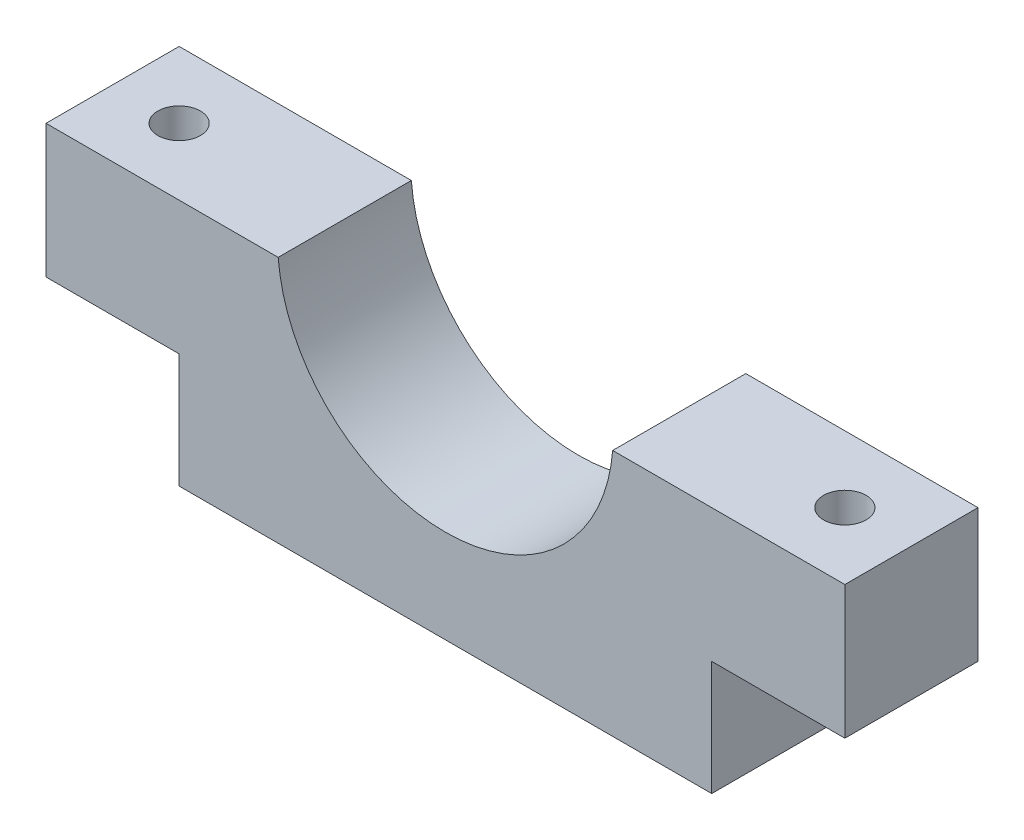
ISO-10303-21;
HEADER;
FILE_DESCRIPTION(('STEP AP214'),'2;1');
FILE_NAME('part.step','',(''),(''),'','','');
FILE_SCHEMA(('AUTOMOTIVE_DESIGN { 1 0 10303 214 1 1 1 1 }'));
ENDSEC;
DATA;
#1=APPLICATION_CONTEXT('core data for automotive mechanical design processes');
#2=APPLICATION_PROTOCOL_DEFINITION('international standard','automotive_design',2000,#1);
#3=PRODUCT_CONTEXT('',#1,'mechanical');
#4=PRODUCT('Part','Part','',(#3));
#5=PRODUCT_RELATED_PRODUCT_CATEGORY('part','',(#4));
#6=PRODUCT_DEFINITION_FORMATION('','',#4);
#7=PRODUCT_DEFINITION_CONTEXT('part definition',#1,'design');
#8=PRODUCT_DEFINITION('design','',#6,#7);
#9=PRODUCT_DEFINITION_SHAPE('','',#8);
#10=(LENGTH_UNIT() NAMED_UNIT(*) SI_UNIT(.MILLI.,.METRE.));
#11=(NAMED_UNIT(*) PLANE_ANGLE_UNIT() SI_UNIT($,.RADIAN.));
#12=(NAMED_UNIT(*) SI_UNIT($,.STERADIAN.) SOLID_ANGLE_UNIT());
#13=UNCERTAINTY_MEASURE_WITH_UNIT(LENGTH_MEASURE(1.E-05),#10,'distance_accuracy_value','');
#14=(GEOMETRIC_REPRESENTATION_CONTEXT(3) GLOBAL_UNCERTAINTY_ASSIGNED_CONTEXT((#13)) GLOBAL_UNIT_ASSIGNED_CONTEXT((#10,
#11,#12)) REPRESENTATION_CONTEXT('',''));
#15=CARTESIAN_POINT('',(0.,0.,0.));
#16=DIRECTION('',(0.,0.,1.));
#17=DIRECTION('',(1.,0.,0.));
#18=AXIS2_PLACEMENT_3D('',#15,#16,#17);
#19=CARTESIAN_POINT('',(0.,9.3,10.));
#20=DIRECTION('',(0.,-1.,0.));
#21=DIRECTION('',(0.,0.,-1.));
#22=AXIS2_PLACEMENT_3D('',#19,#20,#21);
#23=PLANE('',#22);
#24=CARTESIAN_POINT('',(-25.,9.3,5.));
#25=DIRECTION('',(0.,1.,0.));
#26=DIRECTION('',(0.,0.,-1.));
#27=AXIS2_PLACEMENT_3D('',#24,#25,#26);
#28=CIRCLE('',#27,1.6);
#29=CARTESIAN_POINT('',(-25.,9.3,3.4));
#30=VERTEX_POINT('',#29);
#31=EDGE_CURVE('E269',#30,#30,#28,.T.);
#32=ORIENTED_EDGE('',*,*,#31,.F.);
#33=EDGE_LOOP('',(#32));
#34=FACE_BOUND('',#33,.T.);
#35=DIRECTION('',(-1.,0.,0.));
#36=VECTOR('',#35,1.);
#37=CARTESIAN_POINT('',(0.,9.3,0.));
#38=LINE('',#37,#36);
#39=CARTESIAN_POINT('',(-12.5602547744861,9.3,0.));
#40=VERTEX_POINT('',#39);
#41=CARTESIAN_POINT('',(-30.,9.3,0.));
#42=VERTEX_POINT('',#41);
#43=EDGE_CURVE('E154',#40,#42,#38,.T.);
#44=ORIENTED_EDGE('',*,*,#43,.T.);
#45=DIRECTION('',(0.,0.,-1.));
#46=VECTOR('',#45,1.);
#47=CARTESIAN_POINT('',(-30.,9.3,10.));
#48=LINE('',#47,#46);
#49=CARTESIAN_POINT('',(-30.,9.3,10.));
#50=VERTEX_POINT('',#49);
#51=EDGE_CURVE('E11',#50,#42,#48,.T.);
#52=ORIENTED_EDGE('',*,*,#51,.F.);
#53=DIRECTION('',(-1.,0.,0.));
#54=VECTOR('',#53,1.);
#55=CARTESIAN_POINT('',(0.,9.3,10.));
#56=LINE('',#55,#54);
#57=CARTESIAN_POINT('',(-12.5602547744861,9.3,10.));
#58=VERTEX_POINT('',#57);
#59=EDGE_CURVE('E189',#58,#50,#56,.T.);
#60=ORIENTED_EDGE('',*,*,#59,.F.);
#61=DIRECTION('',(0.,0.,-1.));
#62=VECTOR('',#61,1.);
#63=CARTESIAN_POINT('',(-12.5602547744861,9.3,10.));
#64=LINE('',#63,#62);
#65=EDGE_CURVE('E58',#58,#40,#64,.T.);
#66=ORIENTED_EDGE('',*,*,#65,.T.);
#67=EDGE_LOOP('',(#44,#52,#60,#66));
#68=FACE_BOUND('',#67,.T.);
#69=ADVANCED_FACE('F41',(#34,#68),#23,.F.);
#70=CARTESIAN_POINT('',(-30.,0.,10.));
#71=DIRECTION('',(1.,0.,0.));
#72=DIRECTION('',(0.,0.,-1.));
#73=AXIS2_PLACEMENT_3D('',#70,#71,#72);
#74=PLANE('',#73);
#75=DIRECTION('',(0.,-1.,0.));
#76=VECTOR('',#75,1.);
#77=CARTESIAN_POINT('',(-30.,0.,0.));
#78=LINE('',#77,#76);
#79=CARTESIAN_POINT('',(-30.,-0.699999999999999,0.));
#80=VERTEX_POINT('',#79);
#81=EDGE_CURVE('E157',#42,#80,#78,.T.);
#82=ORIENTED_EDGE('',*,*,#81,.T.);
#83=DIRECTION('',(0.,0.,-1.));
#84=VECTOR('',#83,1.);
#85=CARTESIAN_POINT('',(-30.,-0.699999999999999,10.));
#86=LINE('',#85,#84);
#87=CARTESIAN_POINT('',(-30.,-0.699999999999999,10.));
#88=VERTEX_POINT('',#87);
#89=EDGE_CURVE('E50',#88,#80,#86,.T.);
#90=ORIENTED_EDGE('',*,*,#89,.F.);
#91=DIRECTION('',(0.,-1.,0.));
#92=VECTOR('',#91,1.);
#93=CARTESIAN_POINT('',(-30.,0.,10.));
#94=LINE('',#93,#92);
#95=EDGE_CURVE('E102',#50,#88,#94,.T.);
#96=ORIENTED_EDGE('',*,*,#95,.F.);
#97=ORIENTED_EDGE('',*,*,#51,.T.);
#98=EDGE_LOOP('',(#82,#90,#96,#97));
#99=FACE_BOUND('',#98,.T.);
#100=ADVANCED_FACE('F216',(#99),#74,.F.);
#101=CARTESIAN_POINT('',(0.,-0.700000000000002,10.));
#102=DIRECTION('',(0.,-1.,0.));
#103=DIRECTION('',(1.,0.,0.));
#104=AXIS2_PLACEMENT_3D('',#101,#102,#103);
#105=PLANE('',#104);
#106=CARTESIAN_POINT('',(-25.,-0.699999999999999,5.));
#107=DIRECTION('',(0.,1.,0.));
#108=DIRECTION('',(0.,0.,-1.));
#109=AXIS2_PLACEMENT_3D('',#106,#107,#108);
#110=CIRCLE('',#109,1.6);
#111=CARTESIAN_POINT('',(-25.,-0.699999999999999,3.4));
#112=VERTEX_POINT('',#111);
#113=EDGE_CURVE('E274',#112,#112,#110,.T.);
#114=ORIENTED_EDGE('',*,*,#113,.T.);
#115=EDGE_LOOP('',(#114));
#116=FACE_BOUND('',#115,.T.);
#117=DIRECTION('',(-1.,0.,0.));
#118=VECTOR('',#117,1.);
#119=CARTESIAN_POINT('',(0.,-0.700000000000002,0.));
#120=LINE('',#119,#118);
#121=CARTESIAN_POINT('',(-20.,-0.7,0.));
#122=VERTEX_POINT('',#121);
#123=EDGE_CURVE('E162',#122,#80,#120,.T.);
#124=ORIENTED_EDGE('',*,*,#123,.F.);
#125=DIRECTION('',(0.,0.,-1.));
#126=VECTOR('',#125,1.);
#127=CARTESIAN_POINT('',(-20.,-0.7,10.));
#128=LINE('',#127,#126);
#129=CARTESIAN_POINT('',(-20.,-0.7,10.));
#130=VERTEX_POINT('',#129);
#131=EDGE_CURVE('E207',#130,#122,#128,.T.);
#132=ORIENTED_EDGE('',*,*,#131,.F.);
#133=DIRECTION('',(-1.,0.,0.));
#134=VECTOR('',#133,1.);
#135=CARTESIAN_POINT('',(0.,-0.700000000000002,10.));
#136=LINE('',#135,#134);
#137=EDGE_CURVE('E215',#130,#88,#136,.T.);
#138=ORIENTED_EDGE('',*,*,#137,.T.);
#139=ORIENTED_EDGE('',*,*,#89,.T.);
#140=EDGE_LOOP('',(#124,#132,#138,#139));
#141=FACE_BOUND('',#140,.T.);
#142=ADVANCED_FACE('F213',(#116,#141),#105,.T.);
#143=CARTESIAN_POINT('',(-20.,0.,10.));
#144=DIRECTION('',(-1.,0.,0.));
#145=DIRECTION('',(0.,0.,1.));
#146=AXIS2_PLACEMENT_3D('',#143,#144,#145);
#147=PLANE('',#146);
#148=DIRECTION('',(0.,1.,0.));
#149=VECTOR('',#148,1.);
#150=CARTESIAN_POINT('',(-20.,0.,0.));
#151=LINE('',#150,#149);
#152=CARTESIAN_POINT('',(-20.,-9.3,0.));
#153=VERTEX_POINT('',#152);
#154=EDGE_CURVE('E166',#153,#122,#151,.T.);
#155=ORIENTED_EDGE('',*,*,#154,.F.);
#156=DIRECTION('',(0.,0.,-1.));
#157=VECTOR('',#156,1.);
#158=CARTESIAN_POINT('',(-20.,-9.3,10.));
#159=LINE('',#158,#157);
#160=CARTESIAN_POINT('',(-20.,-9.3,10.));
#161=VERTEX_POINT('',#160);
#162=EDGE_CURVE('E204',#161,#153,#159,.T.);
#163=ORIENTED_EDGE('',*,*,#162,.F.);
#164=DIRECTION('',(0.,1.,0.));
#165=VECTOR('',#164,1.);
#166=CARTESIAN_POINT('',(-20.,0.,10.));
#167=LINE('',#166,#165);
#168=EDGE_CURVE('E228',#161,#130,#167,.T.);
#169=ORIENTED_EDGE('',*,*,#168,.T.);
#170=ORIENTED_EDGE('',*,*,#131,.T.);
#171=EDGE_LOOP('',(#155,#163,#169,#170));
#172=FACE_BOUND('',#171,.T.);
#173=ADVANCED_FACE('F224',(#172),#147,.T.);
#174=CARTESIAN_POINT('',(0.,-9.3,10.));
#175=DIRECTION('',(0.,1.,0.));
#176=DIRECTION('',(0.,0.,1.));
#177=AXIS2_PLACEMENT_3D('',#174,#175,#176);
#178=PLANE('',#177);
#179=DIRECTION('',(1.,0.,0.));
#180=VECTOR('',#179,1.);
#181=CARTESIAN_POINT('',(0.,-9.3,0.));
#182=LINE('',#181,#180);
#183=CARTESIAN_POINT('',(20.,-9.3,0.));
#184=VERTEX_POINT('',#183);
#185=EDGE_CURVE('E170',#153,#184,#182,.T.);
#186=ORIENTED_EDGE('',*,*,#185,.T.);
#187=DIRECTION('',(0.,0.,-1.));
#188=VECTOR('',#187,1.);
#189=CARTESIAN_POINT('',(20.,-9.3,10.));
#190=LINE('',#189,#188);
#191=CARTESIAN_POINT('',(20.,-9.3,10.));
#192=VERTEX_POINT('',#191);
#193=EDGE_CURVE('E200',#192,#184,#190,.T.);
#194=ORIENTED_EDGE('',*,*,#193,.F.);
#195=DIRECTION('',(1.,0.,0.));
#196=VECTOR('',#195,1.);
#197=CARTESIAN_POINT('',(0.,-9.3,10.));
#198=LINE('',#197,#196);
#199=EDGE_CURVE('E233',#161,#192,#198,.T.);
#200=ORIENTED_EDGE('',*,*,#199,.F.);
#201=ORIENTED_EDGE('',*,*,#162,.T.);
#202=EDGE_LOOP('',(#186,#194,#200,#201));
#203=FACE_BOUND('',#202,.T.);
#204=ADVANCED_FACE('F333',(#203),#178,.F.);
#205=CARTESIAN_POINT('',(20.,0.,10.));
#206=DIRECTION('',(-1.,0.,0.));
#207=DIRECTION('',(0.,0.,1.));
#208=AXIS2_PLACEMENT_3D('',#205,#206,#207);
#209=PLANE('',#208);
#210=DIRECTION('',(0.,1.,0.));
#211=VECTOR('',#210,1.);
#212=CARTESIAN_POINT('',(20.,0.,0.));
#213=LINE('',#212,#211);
#214=CARTESIAN_POINT('',(20.,-0.699999999999994,0.));
#215=VERTEX_POINT('',#214);
#216=EDGE_CURVE('E173',#184,#215,#213,.T.);
#217=ORIENTED_EDGE('',*,*,#216,.T.);
#218=DIRECTION('',(0.,0.,-1.));
#219=VECTOR('',#218,1.);
#220=CARTESIAN_POINT('',(20.,-0.699999999999994,10.));
#221=LINE('',#220,#219);
#222=CARTESIAN_POINT('',(20.,-0.699999999999994,10.));
#223=VERTEX_POINT('',#222);
#224=EDGE_CURVE('E196',#223,#215,#221,.T.);
#225=ORIENTED_EDGE('',*,*,#224,.F.);
#226=DIRECTION('',(0.,1.,0.));
#227=VECTOR('',#226,1.);
#228=CARTESIAN_POINT('',(20.,0.,10.));
#229=LINE('',#228,#227);
#230=EDGE_CURVE('E240',#192,#223,#229,.T.);
#231=ORIENTED_EDGE('',*,*,#230,.F.);
#232=ORIENTED_EDGE('',*,*,#193,.T.);
#233=EDGE_LOOP('',(#217,#225,#231,#232));
#234=FACE_BOUND('',#233,.T.);
#235=ADVANCED_FACE('F247',(#234),#209,.F.);
#236=CARTESIAN_POINT('',(0.,-0.699999999999992,10.));
#237=DIRECTION('',(0.,1.,0.));
#238=DIRECTION('',(-1.,0.,0.));
#239=AXIS2_PLACEMENT_3D('',#236,#237,#238);
#240=PLANE('',#239);
#241=CARTESIAN_POINT('',(25.,-0.699999999999999,5.));
#242=DIRECTION('',(0.,1.,0.));
#243=DIRECTION('',(0.,0.,1.));
#244=AXIS2_PLACEMENT_3D('',#241,#242,#243);
#245=CIRCLE('',#244,1.6);
#246=CARTESIAN_POINT('',(25.,-0.699999999999999,6.6));
#247=VERTEX_POINT('',#246);
#248=EDGE_CURVE('E158',#247,#247,#245,.T.);
#249=ORIENTED_EDGE('',*,*,#248,.T.);
#250=EDGE_LOOP('',(#249));
#251=FACE_BOUND('',#250,.T.);
#252=DIRECTION('',(1.,0.,0.));
#253=VECTOR('',#252,1.);
#254=CARTESIAN_POINT('',(0.,-0.699999999999992,0.));
#255=LINE('',#254,#253);
#256=CARTESIAN_POINT('',(30.,-0.699999999999995,0.));
#257=VERTEX_POINT('',#256);
#258=EDGE_CURVE('E176',#215,#257,#255,.T.);
#259=ORIENTED_EDGE('',*,*,#258,.T.);
#260=DIRECTION('',(0.,0.,-1.));
#261=VECTOR('',#260,1.);
#262=CARTESIAN_POINT('',(30.,-0.699999999999995,10.));
#263=LINE('',#262,#261);
#264=CARTESIAN_POINT('',(30.,-0.699999999999995,10.));
#265=VERTEX_POINT('',#264);
#266=EDGE_CURVE('E134',#265,#257,#263,.T.);
#267=ORIENTED_EDGE('',*,*,#266,.F.);
#268=DIRECTION('',(1.,0.,0.));
#269=VECTOR('',#268,1.);
#270=CARTESIAN_POINT('',(0.,-0.699999999999992,10.));
#271=LINE('',#270,#269);
#272=EDGE_CURVE('E142',#223,#265,#271,.T.);
#273=ORIENTED_EDGE('',*,*,#272,.F.);
#274=ORIENTED_EDGE('',*,*,#224,.T.);
#275=EDGE_LOOP('',(#259,#267,#273,#274));
#276=FACE_BOUND('',#275,.T.);
#277=ADVANCED_FACE('F250',(#251,#276),#240,.F.);
#278=CARTESIAN_POINT('',(30.,0.,10.));
#279=DIRECTION('',(1.,0.,0.));
#280=DIRECTION('',(0.,0.,-1.));
#281=AXIS2_PLACEMENT_3D('',#278,#279,#280);
#282=PLANE('',#281);
#283=DIRECTION('',(0.,-1.,0.));
#284=VECTOR('',#283,1.);
#285=CARTESIAN_POINT('',(30.,0.,0.));
#286=LINE('',#285,#284);
#287=CARTESIAN_POINT('',(30.,9.3,0.));
#288=VERTEX_POINT('',#287);
#289=EDGE_CURVE('E129',#288,#257,#286,.T.);
#290=ORIENTED_EDGE('',*,*,#289,.F.);
#291=DIRECTION('',(0.,0.,-1.));
#292=VECTOR('',#291,1.);
#293=CARTESIAN_POINT('',(30.,9.3,10.));
#294=LINE('',#293,#292);
#295=CARTESIAN_POINT('',(30.,9.3,10.));
#296=VERTEX_POINT('',#295);
#297=EDGE_CURVE('E124',#296,#288,#294,.T.);
#298=ORIENTED_EDGE('',*,*,#297,.F.);
#299=DIRECTION('',(0.,-1.,0.));
#300=VECTOR('',#299,1.);
#301=CARTESIAN_POINT('',(30.,0.,10.));
#302=LINE('',#301,#300);
#303=EDGE_CURVE('E127',#296,#265,#302,.T.);
#304=ORIENTED_EDGE('',*,*,#303,.T.);
#305=ORIENTED_EDGE('',*,*,#266,.T.);
#306=EDGE_LOOP('',(#290,#298,#304,#305));
#307=FACE_BOUND('',#306,.T.);
#308=ADVANCED_FACE('F126',(#307),#282,.T.);
#309=CARTESIAN_POINT('',(0.,9.3,10.));
#310=DIRECTION('',(0.,1.,0.));
#311=DIRECTION('',(0.,0.,1.));
#312=AXIS2_PLACEMENT_3D('',#309,#310,#311);
#313=PLANE('',#312);
#314=CARTESIAN_POINT('',(25.,9.3,5.));
#315=DIRECTION('',(0.,1.,0.));
#316=DIRECTION('',(0.,0.,1.));
#317=AXIS2_PLACEMENT_3D('',#314,#315,#316);
#318=CIRCLE('',#317,1.6);
#319=CARTESIAN_POINT('',(25.,9.3,6.6));
#320=VERTEX_POINT('',#319);
#321=EDGE_CURVE('E278',#320,#320,#318,.T.);
#322=ORIENTED_EDGE('',*,*,#321,.F.);
#323=EDGE_LOOP('',(#322));
#324=FACE_BOUND('',#323,.T.);
#325=DIRECTION('',(1.,0.,0.));
#326=VECTOR('',#325,1.);
#327=CARTESIAN_POINT('',(0.,9.3,0.));
#328=LINE('',#327,#326);
#329=CARTESIAN_POINT('',(12.5602547744861,9.3,0.));
#330=VERTEX_POINT('',#329);
#331=EDGE_CURVE('E182',#330,#288,#328,.T.);
#332=ORIENTED_EDGE('',*,*,#331,.F.);
#333=DIRECTION('',(0.,0.,-1.));
#334=VECTOR('',#333,1.);
#335=CARTESIAN_POINT('',(12.5602547744861,9.3,10.));
#336=LINE('',#335,#334);
#337=CARTESIAN_POINT('',(12.5602547744861,9.3,10.));
#338=VERTEX_POINT('',#337);
#339=EDGE_CURVE('E90',#338,#330,#336,.T.);
#340=ORIENTED_EDGE('',*,*,#339,.F.);
#341=DIRECTION('',(1.,0.,0.));
#342=VECTOR('',#341,1.);
#343=CARTESIAN_POINT('',(0.,9.3,10.));
#344=LINE('',#343,#342);
#345=EDGE_CURVE('E140',#338,#296,#344,.T.);
#346=ORIENTED_EDGE('',*,*,#345,.T.);
#347=ORIENTED_EDGE('',*,*,#297,.T.);
#348=EDGE_LOOP('',(#332,#340,#346,#347));
#349=FACE_BOUND('',#348,.T.);
#350=ADVANCED_FACE('F146',(#324,#349),#313,.T.);
#351=CARTESIAN_POINT('',(0.,10.3,10.));
#352=DIRECTION('',(0.,0.,-1.));
#353=DIRECTION('',(-1.,0.,0.));
#354=AXIS2_PLACEMENT_3D('',#351,#352,#353);
#355=CYLINDRICAL_SURFACE('',#354,12.6);
#356=CARTESIAN_POINT('',(0.,10.3,0.));
#357=DIRECTION('',(0.,0.,1.));
#358=DIRECTION('',(1.,0.,0.));
#359=AXIS2_PLACEMENT_3D('',#356,#357,#358);
#360=CIRCLE('',#359,12.6);
#361=EDGE_CURVE('E185',#40,#330,#360,.T.);
#362=ORIENTED_EDGE('',*,*,#361,.F.);
#363=ORIENTED_EDGE('',*,*,#65,.F.);
#364=CARTESIAN_POINT('',(0.,10.3,10.));
#365=DIRECTION('',(0.,0.,1.));
#366=DIRECTION('',(1.,0.,0.));
#367=AXIS2_PLACEMENT_3D('',#364,#365,#366);
#368=CIRCLE('',#367,12.6);
#369=EDGE_CURVE('E148',#58,#338,#368,.T.);
#370=ORIENTED_EDGE('',*,*,#369,.T.);
#371=ORIENTED_EDGE('',*,*,#339,.T.);
#372=EDGE_LOOP('',(#362,#363,#370,#371));
#373=FACE_BOUND('',#372,.T.);
#374=ADVANCED_FACE('F251',(#373),#355,.F.);
#375=CARTESIAN_POINT('',(0.,0.,10.));
#376=DIRECTION('',(0.,0.,1.));
#377=DIRECTION('',(1.,0.,0.));
#378=AXIS2_PLACEMENT_3D('',#375,#376,#377);
#379=PLANE('',#378);
#380=ORIENTED_EDGE('',*,*,#59,.T.);
#381=ORIENTED_EDGE('',*,*,#95,.T.);
#382=ORIENTED_EDGE('',*,*,#137,.F.);
#383=ORIENTED_EDGE('',*,*,#168,.F.);
#384=ORIENTED_EDGE('',*,*,#199,.T.);
#385=ORIENTED_EDGE('',*,*,#230,.T.);
#386=ORIENTED_EDGE('',*,*,#272,.T.);
#387=ORIENTED_EDGE('',*,*,#303,.F.);
#388=ORIENTED_EDGE('',*,*,#345,.F.);
#389=ORIENTED_EDGE('',*,*,#369,.F.);
#390=EDGE_LOOP('',(#380,#381,#382,#383,#384,#385,#386,#387,#388,#389));
#391=FACE_BOUND('',#390,.T.);
#392=ADVANCED_FACE('F138',(#391),#379,.T.);
#393=CARTESIAN_POINT('',(0.,0.,0.));
#394=DIRECTION('',(0.,0.,1.));
#395=DIRECTION('',(1.,0.,0.));
#396=AXIS2_PLACEMENT_3D('',#393,#394,#395);
#397=PLANE('',#396);
#398=ORIENTED_EDGE('',*,*,#43,.F.);
#399=ORIENTED_EDGE('',*,*,#361,.T.);
#400=ORIENTED_EDGE('',*,*,#331,.T.);
#401=ORIENTED_EDGE('',*,*,#289,.T.);
#402=ORIENTED_EDGE('',*,*,#258,.F.);
#403=ORIENTED_EDGE('',*,*,#216,.F.);
#404=ORIENTED_EDGE('',*,*,#185,.F.);
#405=ORIENTED_EDGE('',*,*,#154,.T.);
#406=ORIENTED_EDGE('',*,*,#123,.T.);
#407=ORIENTED_EDGE('',*,*,#81,.F.);
#408=EDGE_LOOP('',(#398,#399,#400,#401,#402,#403,#404,#405,#406,#407));
#409=FACE_BOUND('',#408,.T.);
#410=ADVANCED_FACE('F219',(#409),#397,.F.);
#411=CARTESIAN_POINT('',(25.,-0.699999999999999,5.));
#412=DIRECTION('',(0.,1.,0.));
#413=DIRECTION('',(0.,0.,1.));
#414=AXIS2_PLACEMENT_3D('',#411,#412,#413);
#415=CYLINDRICAL_SURFACE('',#414,1.6);
#416=ORIENTED_EDGE('',*,*,#248,.F.);
#417=EDGE_LOOP('',(#416));
#418=FACE_BOUND('',#417,.T.);
#419=ORIENTED_EDGE('',*,*,#321,.T.);
#420=EDGE_LOOP('',(#419));
#421=FACE_BOUND('',#420,.T.);
#422=ADVANCED_FACE('F287',(#418,#421),#415,.F.);
#423=CARTESIAN_POINT('',(-25.,-0.699999999999999,5.));
#424=DIRECTION('',(0.,1.,0.));
#425=DIRECTION('',(0.,0.,1.));
#426=AXIS2_PLACEMENT_3D('',#423,#424,#425);
#427=CYLINDRICAL_SURFACE('',#426,1.6);
#428=ORIENTED_EDGE('',*,*,#113,.F.);
#429=EDGE_LOOP('',(#428));
#430=FACE_BOUND('',#429,.T.);
#431=ORIENTED_EDGE('',*,*,#31,.T.);
#432=EDGE_LOOP('',(#431));
#433=FACE_BOUND('',#432,.T.);
#434=ADVANCED_FACE('F290',(#430,#433),#427,.F.);
#435=CLOSED_SHELL('',(#69,#100,#142,#173,#204,#235,#277,#308,#350,#374,#392,#410,#422,#434));
#436=MANIFOLD_SOLID_BREP('B2',#435);
#437=ADVANCED_BREP_SHAPE_REPRESENTATION('',(#18,#436),#14);
#438=SHAPE_DEFINITION_REPRESENTATION(#9,#437);
ENDSEC;
END-ISO-10303-21;
